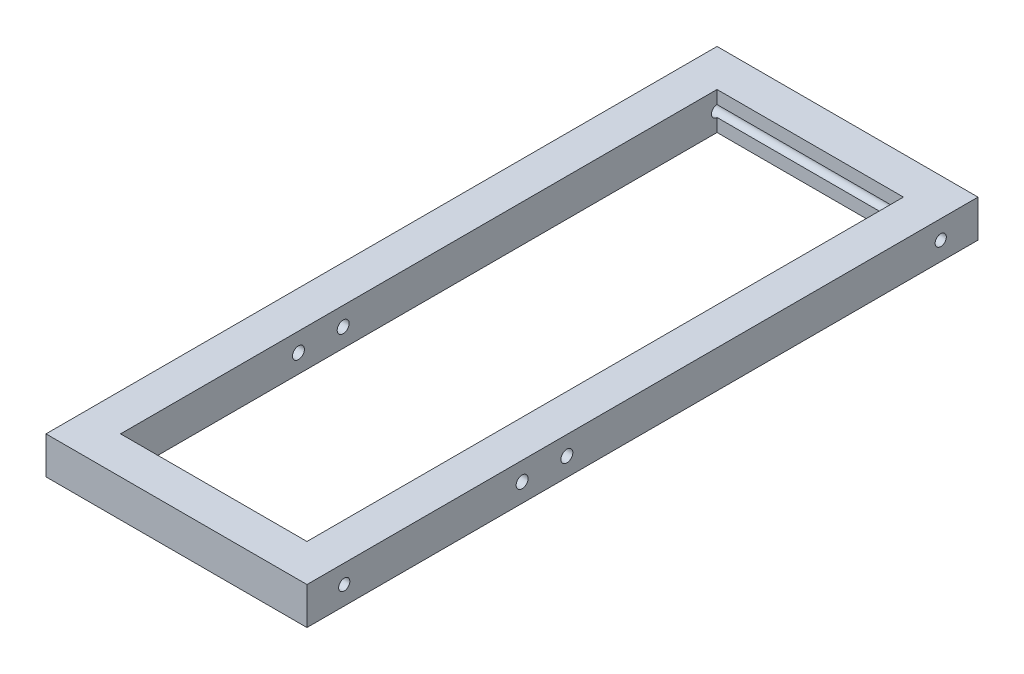
ISO-10303-21;
HEADER;
FILE_DESCRIPTION(('STEP AP214'),'2;1');
FILE_NAME('part.step','',(''),(''),'','','');
FILE_SCHEMA(('AUTOMOTIVE_DESIGN { 1 0 10303 214 1 1 1 1 }'));
ENDSEC;
DATA;
#1=APPLICATION_CONTEXT('core data for automotive mechanical design processes');
#2=APPLICATION_PROTOCOL_DEFINITION('international standard','automotive_design',2000,#1);
#3=PRODUCT_CONTEXT('',#1,'mechanical');
#4=PRODUCT('Part','Part','',(#3));
#5=PRODUCT_RELATED_PRODUCT_CATEGORY('part','',(#4));
#6=PRODUCT_DEFINITION_FORMATION('','',#4);
#7=PRODUCT_DEFINITION_CONTEXT('part definition',#1,'design');
#8=PRODUCT_DEFINITION('design','',#6,#7);
#9=PRODUCT_DEFINITION_SHAPE('','',#8);
#10=(LENGTH_UNIT() NAMED_UNIT(*) SI_UNIT(.MILLI.,.METRE.));
#11=(NAMED_UNIT(*) PLANE_ANGLE_UNIT() SI_UNIT($,.RADIAN.));
#12=(NAMED_UNIT(*) SI_UNIT($,.STERADIAN.) SOLID_ANGLE_UNIT());
#13=UNCERTAINTY_MEASURE_WITH_UNIT(LENGTH_MEASURE(1.E-05),#10,'distance_accuracy_value','');
#14=(GEOMETRIC_REPRESENTATION_CONTEXT(3) GLOBAL_UNCERTAINTY_ASSIGNED_CONTEXT((#13)) GLOBAL_UNIT_ASSIGNED_CONTEXT((#10,
#11,#12)) REPRESENTATION_CONTEXT('',''));
#15=CARTESIAN_POINT('',(0.,0.,0.));
#16=DIRECTION('',(0.,0.,1.));
#17=DIRECTION('',(1.,0.,0.));
#18=AXIS2_PLACEMENT_3D('',#15,#16,#17);
#19=CARTESIAN_POINT('',(-25.,5.,80.));
#20=DIRECTION('',(0.,0.,-1.));
#21=DIRECTION('',(-1.,0.,0.));
#22=AXIS2_PLACEMENT_3D('',#19,#20,#21);
#23=PLANE('',#22);
#24=DIRECTION('',(1.,0.,0.));
#25=VECTOR('',#24,1.);
#26=CARTESIAN_POINT('',(-60.,1.49999999999998,80.));
#27=LINE('',#26,#25);
#28=CARTESIAN_POINT('',(-25.,1.49999999999998,80.));
#29=VERTEX_POINT('',#28);
#30=CARTESIAN_POINT('',(25.,1.49999999999998,80.));
#31=VERTEX_POINT('',#30);
#32=EDGE_CURVE('E248',#29,#31,#27,.T.);
#33=ORIENTED_EDGE('',*,*,#32,.F.);
#34=DIRECTION('',(0.,-1.,0.));
#35=VECTOR('',#34,1.);
#36=CARTESIAN_POINT('',(-25.,5.,80.));
#37=LINE('',#36,#35);
#38=CARTESIAN_POINT('',(-25.,5.,80.));
#39=VERTEX_POINT('',#38);
#40=EDGE_CURVE('E154',#39,#29,#37,.T.);
#41=ORIENTED_EDGE('',*,*,#40,.F.);
#42=DIRECTION('',(1.,0.,0.));
#43=VECTOR('',#42,1.);
#44=CARTESIAN_POINT('',(-25.,5.,80.));
#45=LINE('',#44,#43);
#46=CARTESIAN_POINT('',(25.,5.,80.));
#47=VERTEX_POINT('',#46);
#48=EDGE_CURVE('E263',#39,#47,#45,.T.);
#49=ORIENTED_EDGE('',*,*,#48,.T.);
#50=DIRECTION('',(0.,-1.,0.));
#51=VECTOR('',#50,1.);
#52=CARTESIAN_POINT('',(25.,5.,80.));
#53=LINE('',#52,#51);
#54=EDGE_CURVE('E168',#47,#31,#53,.T.);
#55=ORIENTED_EDGE('',*,*,#54,.T.);
#56=EDGE_LOOP('',(#33,#41,#49,#55));
#57=FACE_BOUND('',#56,.T.);
#58=ADVANCED_FACE('F39',(#57),#23,.T.);
#59=CARTESIAN_POINT('',(-25.,5.,-80.));
#60=DIRECTION('',(0.,0.,1.));
#61=DIRECTION('',(1.,0.,0.));
#62=AXIS2_PLACEMENT_3D('',#59,#60,#61);
#63=PLANE('',#62);
#64=DIRECTION('',(1.,0.,0.));
#65=VECTOR('',#64,1.);
#66=CARTESIAN_POINT('',(-60.,-1.5,-80.));
#67=LINE('',#66,#65);
#68=CARTESIAN_POINT('',(-25.,-1.5,-80.));
#69=VERTEX_POINT('',#68);
#70=CARTESIAN_POINT('',(25.,-1.5,-80.));
#71=VERTEX_POINT('',#70);
#72=EDGE_CURVE('E130',#69,#71,#67,.T.);
#73=ORIENTED_EDGE('',*,*,#72,.F.);
#74=DIRECTION('',(0.,-1.,0.));
#75=VECTOR('',#74,1.);
#76=CARTESIAN_POINT('',(-25.,5.,-80.));
#77=LINE('',#76,#75);
#78=CARTESIAN_POINT('',(-25.,-5.,-80.));
#79=VERTEX_POINT('',#78);
#80=EDGE_CURVE('E142',#69,#79,#77,.T.);
#81=ORIENTED_EDGE('',*,*,#80,.T.);
#82=DIRECTION('',(-1.,0.,0.));
#83=VECTOR('',#82,1.);
#84=CARTESIAN_POINT('',(-25.,-5.,-80.));
#85=LINE('',#84,#83);
#86=CARTESIAN_POINT('',(25.,-5.,-80.));
#87=VERTEX_POINT('',#86);
#88=EDGE_CURVE('E283',#87,#79,#85,.T.);
#89=ORIENTED_EDGE('',*,*,#88,.F.);
#90=DIRECTION('',(0.,-1.,0.));
#91=VECTOR('',#90,1.);
#92=CARTESIAN_POINT('',(25.,5.,-80.));
#93=LINE('',#92,#91);
#94=EDGE_CURVE('E144',#71,#87,#93,.T.);
#95=ORIENTED_EDGE('',*,*,#94,.F.);
#96=EDGE_LOOP('',(#73,#81,#89,#95));
#97=FACE_BOUND('',#96,.T.);
#98=ADVANCED_FACE('F140',(#97),#63,.T.);
#99=CARTESIAN_POINT('',(0.,5.,0.));
#100=DIRECTION('',(0.,-1.,0.));
#101=DIRECTION('',(0.,0.,-1.));
#102=AXIS2_PLACEMENT_3D('',#99,#100,#101);
#103=PLANE('',#102);
#104=DIRECTION('',(0.,0.,-1.));
#105=VECTOR('',#104,1.);
#106=CARTESIAN_POINT('',(35.,5.,90.));
#107=LINE('',#106,#105);
#108=CARTESIAN_POINT('',(35.,5.,90.));
#109=VERTEX_POINT('',#108);
#110=CARTESIAN_POINT('',(35.,5.,-90.));
#111=VERTEX_POINT('',#110);
#112=EDGE_CURVE('E173',#109,#111,#107,.T.);
#113=ORIENTED_EDGE('',*,*,#112,.T.);
#114=DIRECTION('',(-1.,0.,0.));
#115=VECTOR('',#114,1.);
#116=CARTESIAN_POINT('',(-35.,5.,-90.));
#117=LINE('',#116,#115);
#118=CARTESIAN_POINT('',(-35.,5.,-90.));
#119=VERTEX_POINT('',#118);
#120=EDGE_CURVE('E177',#111,#119,#117,.T.);
#121=ORIENTED_EDGE('',*,*,#120,.T.);
#122=DIRECTION('',(0.,0.,1.));
#123=VECTOR('',#122,1.);
#124=CARTESIAN_POINT('',(-35.,5.,90.));
#125=LINE('',#124,#123);
#126=CARTESIAN_POINT('',(-35.,5.,90.));
#127=VERTEX_POINT('',#126);
#128=EDGE_CURVE('E181',#119,#127,#125,.T.);
#129=ORIENTED_EDGE('',*,*,#128,.T.);
#130=DIRECTION('',(1.,0.,0.));
#131=VECTOR('',#130,1.);
#132=CARTESIAN_POINT('',(-35.,5.,90.));
#133=LINE('',#132,#131);
#134=EDGE_CURVE('E184',#127,#109,#133,.T.);
#135=ORIENTED_EDGE('',*,*,#134,.T.);
#136=EDGE_LOOP('',(#113,#121,#129,#135));
#137=FACE_BOUND('',#136,.T.);
#138=ORIENTED_EDGE('',*,*,#48,.F.);
#139=DIRECTION('',(0.,0.,1.));
#140=VECTOR('',#139,1.);
#141=CARTESIAN_POINT('',(-25.,5.,80.));
#142=LINE('',#141,#140);
#143=CARTESIAN_POINT('',(-25.,5.,-80.));
#144=VERTEX_POINT('',#143);
#145=EDGE_CURVE('E273',#144,#39,#142,.T.);
#146=ORIENTED_EDGE('',*,*,#145,.F.);
#147=DIRECTION('',(-1.,0.,0.));
#148=VECTOR('',#147,1.);
#149=CARTESIAN_POINT('',(-25.,5.,-80.));
#150=LINE('',#149,#148);
#151=CARTESIAN_POINT('',(25.,5.,-80.));
#152=VERTEX_POINT('',#151);
#153=EDGE_CURVE('E269',#152,#144,#150,.T.);
#154=ORIENTED_EDGE('',*,*,#153,.F.);
#155=DIRECTION('',(0.,0.,-1.));
#156=VECTOR('',#155,1.);
#157=CARTESIAN_POINT('',(25.,5.,80.));
#158=LINE('',#157,#156);
#159=EDGE_CURVE('E266',#47,#152,#158,.T.);
#160=ORIENTED_EDGE('',*,*,#159,.F.);
#161=EDGE_LOOP('',(#138,#146,#154,#160));
#162=FACE_BOUND('',#161,.T.);
#163=ADVANCED_FACE('F311',(#137,#162),#103,.F.);
#164=CARTESIAN_POINT('',(0.,-5.,0.));
#165=DIRECTION('',(0.,-1.,0.));
#166=DIRECTION('',(0.,0.,-1.));
#167=AXIS2_PLACEMENT_3D('',#164,#165,#166);
#168=PLANE('',#167);
#169=DIRECTION('',(0.,0.,-1.));
#170=VECTOR('',#169,1.);
#171=CARTESIAN_POINT('',(35.,-5.,90.));
#172=LINE('',#171,#170);
#173=CARTESIAN_POINT('',(35.,-5.,90.));
#174=VERTEX_POINT('',#173);
#175=CARTESIAN_POINT('',(35.,-5.,-90.));
#176=VERTEX_POINT('',#175);
#177=EDGE_CURVE('E172',#174,#176,#172,.T.);
#178=ORIENTED_EDGE('',*,*,#177,.F.);
#179=DIRECTION('',(1.,0.,0.));
#180=VECTOR('',#179,1.);
#181=CARTESIAN_POINT('',(-35.,-5.,90.));
#182=LINE('',#181,#180);
#183=CARTESIAN_POINT('',(-35.,-5.,90.));
#184=VERTEX_POINT('',#183);
#185=EDGE_CURVE('E178',#184,#174,#182,.T.);
#186=ORIENTED_EDGE('',*,*,#185,.F.);
#187=DIRECTION('',(0.,0.,1.));
#188=VECTOR('',#187,1.);
#189=CARTESIAN_POINT('',(-35.,-5.,90.));
#190=LINE('',#189,#188);
#191=CARTESIAN_POINT('',(-35.,-5.,-90.));
#192=VERTEX_POINT('',#191);
#193=EDGE_CURVE('E194',#192,#184,#190,.T.);
#194=ORIENTED_EDGE('',*,*,#193,.F.);
#195=DIRECTION('',(-1.,0.,0.));
#196=VECTOR('',#195,1.);
#197=CARTESIAN_POINT('',(-35.,-5.,-90.));
#198=LINE('',#197,#196);
#199=EDGE_CURVE('E191',#176,#192,#198,.T.);
#200=ORIENTED_EDGE('',*,*,#199,.F.);
#201=EDGE_LOOP('',(#178,#186,#194,#200));
#202=FACE_BOUND('',#201,.T.);
#203=DIRECTION('',(0.,0.,1.));
#204=VECTOR('',#203,1.);
#205=CARTESIAN_POINT('',(-25.,-5.,80.));
#206=LINE('',#205,#204);
#207=CARTESIAN_POINT('',(-25.,-5.,80.));
#208=VERTEX_POINT('',#207);
#209=EDGE_CURVE('E150',#79,#208,#206,.T.);
#210=ORIENTED_EDGE('',*,*,#209,.T.);
#211=DIRECTION('',(1.,0.,0.));
#212=VECTOR('',#211,1.);
#213=CARTESIAN_POINT('',(-25.,-5.,80.));
#214=LINE('',#213,#212);
#215=CARTESIAN_POINT('',(25.,-5.,80.));
#216=VERTEX_POINT('',#215);
#217=EDGE_CURVE('E262',#208,#216,#214,.T.);
#218=ORIENTED_EDGE('',*,*,#217,.T.);
#219=DIRECTION('',(0.,0.,-1.));
#220=VECTOR('',#219,1.);
#221=CARTESIAN_POINT('',(25.,-5.,80.));
#222=LINE('',#221,#220);
#223=EDGE_CURVE('E279',#216,#87,#222,.T.);
#224=ORIENTED_EDGE('',*,*,#223,.T.);
#225=ORIENTED_EDGE('',*,*,#88,.T.);
#226=EDGE_LOOP('',(#210,#218,#224,#225));
#227=FACE_BOUND('',#226,.T.);
#228=ADVANCED_FACE('F287',(#202,#227),#168,.T.);
#229=CARTESIAN_POINT('',(35.,5.,90.));
#230=DIRECTION('',(-1.,0.,0.));
#231=DIRECTION('',(0.,0.,1.));
#232=AXIS2_PLACEMENT_3D('',#229,#230,#231);
#233=PLANE('',#232);
#234=CARTESIAN_POINT('',(35.,-0.0109282709262837,32.2875238508389));
#235=DIRECTION('',(-1.,0.,0.));
#236=DIRECTION('',(0.,0.,1.));
#237=AXIS2_PLACEMENT_3D('',#234,#235,#236);
#238=CIRCLE('',#237,1.59999999999999);
#239=CARTESIAN_POINT('',(35.,-0.0109282709262837,33.8875238508389));
#240=VERTEX_POINT('',#239);
#241=EDGE_CURVE('E488',#240,#240,#238,.T.);
#242=ORIENTED_EDGE('',*,*,#241,.T.);
#243=EDGE_LOOP('',(#242));
#244=FACE_BOUND('',#243,.T.);
#245=CARTESIAN_POINT('',(35.,-0.00299899200374121,20.2858146368323));
#246=DIRECTION('',(-1.,0.,0.));
#247=DIRECTION('',(0.,0.,1.));
#248=AXIS2_PLACEMENT_3D('',#245,#246,#247);
#249=CIRCLE('',#248,1.59999999999999);
#250=CARTESIAN_POINT('',(35.,-0.00299899200374121,21.8858146368323));
#251=VERTEX_POINT('',#250);
#252=EDGE_CURVE('E216',#251,#251,#249,.T.);
#253=ORIENTED_EDGE('',*,*,#252,.T.);
#254=EDGE_LOOP('',(#253));
#255=FACE_BOUND('',#254,.T.);
#256=CARTESIAN_POINT('',(35.,0.,80.));
#257=DIRECTION('',(-1.,0.,0.));
#258=DIRECTION('',(0.,0.,1.));
#259=AXIS2_PLACEMENT_3D('',#256,#257,#258);
#260=CIRCLE('',#259,1.5);
#261=CARTESIAN_POINT('',(35.,0.,81.5));
#262=VERTEX_POINT('',#261);
#263=EDGE_CURVE('E258',#262,#262,#260,.T.);
#264=ORIENTED_EDGE('',*,*,#263,.T.);
#265=EDGE_LOOP('',(#264));
#266=FACE_BOUND('',#265,.T.);
#267=CARTESIAN_POINT('',(35.,0.,-80.));
#268=DIRECTION('',(-1.,0.,0.));
#269=DIRECTION('',(0.,0.,1.));
#270=AXIS2_PLACEMENT_3D('',#267,#268,#269);
#271=CIRCLE('',#270,1.5);
#272=CARTESIAN_POINT('',(35.,0.,-78.5));
#273=VERTEX_POINT('',#272);
#274=EDGE_CURVE('E242',#273,#273,#271,.T.);
#275=ORIENTED_EDGE('',*,*,#274,.T.);
#276=EDGE_LOOP('',(#275));
#277=FACE_BOUND('',#276,.T.);
#278=ORIENTED_EDGE('',*,*,#177,.T.);
#279=DIRECTION('',(0.,-1.,0.));
#280=VECTOR('',#279,1.);
#281=CARTESIAN_POINT('',(35.,5.,-90.));
#282=LINE('',#281,#280);
#283=EDGE_CURVE('E136',#111,#176,#282,.T.);
#284=ORIENTED_EDGE('',*,*,#283,.F.);
#285=ORIENTED_EDGE('',*,*,#112,.F.);
#286=DIRECTION('',(0.,-1.,0.));
#287=VECTOR('',#286,1.);
#288=CARTESIAN_POINT('',(35.,5.,90.));
#289=LINE('',#288,#287);
#290=EDGE_CURVE('E187',#109,#174,#289,.T.);
#291=ORIENTED_EDGE('',*,*,#290,.T.);
#292=EDGE_LOOP('',(#278,#284,#285,#291));
#293=FACE_BOUND('',#292,.T.);
#294=ADVANCED_FACE('F41',(#244,#255,#266,#277,#293),#233,.F.);
#295=CARTESIAN_POINT('',(-35.,5.,-90.));
#296=DIRECTION('',(0.,0.,1.));
#297=DIRECTION('',(1.,0.,0.));
#298=AXIS2_PLACEMENT_3D('',#295,#296,#297);
#299=PLANE('',#298);
#300=ORIENTED_EDGE('',*,*,#199,.T.);
#301=DIRECTION('',(0.,-1.,0.));
#302=VECTOR('',#301,1.);
#303=CARTESIAN_POINT('',(-35.,5.,-90.));
#304=LINE('',#303,#302);
#305=EDGE_CURVE('E206',#119,#192,#304,.T.);
#306=ORIENTED_EDGE('',*,*,#305,.F.);
#307=ORIENTED_EDGE('',*,*,#120,.F.);
#308=ORIENTED_EDGE('',*,*,#283,.T.);
#309=EDGE_LOOP('',(#300,#306,#307,#308));
#310=FACE_BOUND('',#309,.T.);
#311=ADVANCED_FACE('F342',(#310),#299,.F.);
#312=CARTESIAN_POINT('',(-35.,5.,90.));
#313=DIRECTION('',(1.,0.,0.));
#314=DIRECTION('',(0.,0.,-1.));
#315=AXIS2_PLACEMENT_3D('',#312,#313,#314);
#316=PLANE('',#315);
#317=CARTESIAN_POINT('',(-35.,-0.0109282709262837,32.2875238508389));
#318=DIRECTION('',(-1.,0.,0.));
#319=DIRECTION('',(0.,0.,1.));
#320=AXIS2_PLACEMENT_3D('',#317,#318,#319);
#321=CIRCLE('',#320,1.6);
#322=CARTESIAN_POINT('',(-35.,-0.0109282709262837,33.8875238508389));
#323=VERTEX_POINT('',#322);
#324=EDGE_CURVE('E490',#323,#323,#321,.T.);
#325=ORIENTED_EDGE('',*,*,#324,.F.);
#326=EDGE_LOOP('',(#325));
#327=FACE_BOUND('',#326,.T.);
#328=CARTESIAN_POINT('',(-35.,-0.00299899200374121,20.2858146368323));
#329=DIRECTION('',(-1.,0.,0.));
#330=DIRECTION('',(0.,0.,1.));
#331=AXIS2_PLACEMENT_3D('',#328,#329,#330);
#332=CIRCLE('',#331,1.6);
#333=CARTESIAN_POINT('',(-35.,-0.00299899200374121,21.8858146368323));
#334=VERTEX_POINT('',#333);
#335=EDGE_CURVE('E224',#334,#334,#332,.T.);
#336=ORIENTED_EDGE('',*,*,#335,.F.);
#337=EDGE_LOOP('',(#336));
#338=FACE_BOUND('',#337,.T.);
#339=CARTESIAN_POINT('',(-35.,0.,80.));
#340=DIRECTION('',(1.,0.,0.));
#341=DIRECTION('',(0.,0.,-1.));
#342=AXIS2_PLACEMENT_3D('',#339,#340,#341);
#343=CIRCLE('',#342,1.5);
#344=CARTESIAN_POINT('',(-35.,0.,78.5));
#345=VERTEX_POINT('',#344);
#346=EDGE_CURVE('E254',#345,#345,#343,.T.);
#347=ORIENTED_EDGE('',*,*,#346,.T.);
#348=EDGE_LOOP('',(#347));
#349=FACE_BOUND('',#348,.T.);
#350=CARTESIAN_POINT('',(-35.,0.,-80.));
#351=DIRECTION('',(1.,0.,0.));
#352=DIRECTION('',(0.,0.,-1.));
#353=AXIS2_PLACEMENT_3D('',#350,#351,#352);
#354=CIRCLE('',#353,1.5);
#355=CARTESIAN_POINT('',(-35.,0.,-81.5));
#356=VERTEX_POINT('',#355);
#357=EDGE_CURVE('E238',#356,#356,#354,.T.);
#358=ORIENTED_EDGE('',*,*,#357,.T.);
#359=EDGE_LOOP('',(#358));
#360=FACE_BOUND('',#359,.T.);
#361=ORIENTED_EDGE('',*,*,#193,.T.);
#362=DIRECTION('',(0.,-1.,0.));
#363=VECTOR('',#362,1.);
#364=CARTESIAN_POINT('',(-35.,5.,90.));
#365=LINE('',#364,#363);
#366=EDGE_CURVE('E202',#127,#184,#365,.T.);
#367=ORIENTED_EDGE('',*,*,#366,.F.);
#368=ORIENTED_EDGE('',*,*,#128,.F.);
#369=ORIENTED_EDGE('',*,*,#305,.T.);
#370=EDGE_LOOP('',(#361,#367,#368,#369));
#371=FACE_BOUND('',#370,.T.);
#372=ADVANCED_FACE('F336',(#327,#338,#349,#360,#371),#316,.F.);
#373=CARTESIAN_POINT('',(-35.,5.,90.));
#374=DIRECTION('',(0.,0.,-1.));
#375=DIRECTION('',(-1.,0.,0.));
#376=AXIS2_PLACEMENT_3D('',#373,#374,#375);
#377=PLANE('',#376);
#378=ORIENTED_EDGE('',*,*,#185,.T.);
#379=ORIENTED_EDGE('',*,*,#290,.F.);
#380=ORIENTED_EDGE('',*,*,#134,.F.);
#381=ORIENTED_EDGE('',*,*,#366,.T.);
#382=EDGE_LOOP('',(#378,#379,#380,#381));
#383=FACE_BOUND('',#382,.T.);
#384=ADVANCED_FACE('F332',(#383),#377,.F.);
#385=DIRECTION('',(1.,0.,0.));
#386=VECTOR('',#385,1.);
#387=CARTESIAN_POINT('',(-60.,-1.50000000000002,80.));
#388=LINE('',#387,#386);
#389=CARTESIAN_POINT('',(25.,-1.50000000000002,80.));
#390=VERTEX_POINT('',#389);
#391=CARTESIAN_POINT('',(-25.,-1.50000000000002,80.));
#392=VERTEX_POINT('',#391);
#393=EDGE_CURVE('E56',#390,#392,#388,.F.);
#394=ORIENTED_EDGE('',*,*,#393,.F.);
#395=EDGE_CURVE('E167',#390,#216,#53,.T.);
#396=ORIENTED_EDGE('',*,*,#395,.T.);
#397=ORIENTED_EDGE('',*,*,#217,.F.);
#398=EDGE_CURVE('E159',#392,#208,#37,.T.);
#399=ORIENTED_EDGE('',*,*,#398,.F.);
#400=EDGE_LOOP('',(#394,#396,#397,#399));
#401=FACE_BOUND('',#400,.T.);
#402=ADVANCED_FACE('F297',(#401),#23,.T.);
#403=CARTESIAN_POINT('',(25.,5.,80.));
#404=DIRECTION('',(-1.,0.,0.));
#405=DIRECTION('',(0.,0.,1.));
#406=AXIS2_PLACEMENT_3D('',#403,#404,#405);
#407=PLANE('',#406);
#408=CARTESIAN_POINT('',(25.,-0.0109282709262837,32.2875238508389));
#409=DIRECTION('',(-1.,0.,0.));
#410=DIRECTION('',(0.,0.,1.));
#411=AXIS2_PLACEMENT_3D('',#408,#409,#410);
#412=CIRCLE('',#411,1.6);
#413=CARTESIAN_POINT('',(25.,-0.0109282709262837,33.8875238508389));
#414=VERTEX_POINT('',#413);
#415=EDGE_CURVE('E230',#414,#414,#412,.T.);
#416=ORIENTED_EDGE('',*,*,#415,.F.);
#417=EDGE_LOOP('',(#416));
#418=FACE_BOUND('',#417,.T.);
#419=CARTESIAN_POINT('',(25.,-0.00299899200374121,20.2858146368323));
#420=DIRECTION('',(-1.,0.,0.));
#421=DIRECTION('',(0.,0.,1.));
#422=AXIS2_PLACEMENT_3D('',#419,#420,#421);
#423=CIRCLE('',#422,1.6);
#424=CARTESIAN_POINT('',(25.,-0.00299899200374121,21.8858146368323));
#425=VERTEX_POINT('',#424);
#426=EDGE_CURVE('E215',#425,#425,#423,.T.);
#427=ORIENTED_EDGE('',*,*,#426,.F.);
#428=EDGE_LOOP('',(#427));
#429=FACE_BOUND('',#428,.T.);
#430=CARTESIAN_POINT('',(25.,0.,80.));
#431=DIRECTION('',(-1.,0.,0.));
#432=DIRECTION('',(0.,0.,1.));
#433=AXIS2_PLACEMENT_3D('',#430,#431,#432);
#434=CIRCLE('',#433,1.5);
#435=EDGE_CURVE('E251',#31,#390,#434,.T.);
#436=ORIENTED_EDGE('',*,*,#435,.F.);
#437=ORIENTED_EDGE('',*,*,#54,.F.);
#438=ORIENTED_EDGE('',*,*,#159,.T.);
#439=CARTESIAN_POINT('',(25.,1.5,-80.));
#440=VERTEX_POINT('',#439);
#441=EDGE_CURVE('E163',#152,#440,#93,.T.);
#442=ORIENTED_EDGE('',*,*,#441,.T.);
#443=CARTESIAN_POINT('',(25.,0.,-80.));
#444=DIRECTION('',(-1.,0.,0.));
#445=DIRECTION('',(0.,0.,1.));
#446=AXIS2_PLACEMENT_3D('',#443,#444,#445);
#447=CIRCLE('',#446,1.5);
#448=EDGE_CURVE('E146',#71,#440,#447,.T.);
#449=ORIENTED_EDGE('',*,*,#448,.F.);
#450=ORIENTED_EDGE('',*,*,#94,.T.);
#451=ORIENTED_EDGE('',*,*,#223,.F.);
#452=ORIENTED_EDGE('',*,*,#395,.F.);
#453=EDGE_LOOP('',(#436,#437,#438,#442,#449,#450,#451,#452));
#454=FACE_BOUND('',#453,.T.);
#455=ADVANCED_FACE('F293',(#418,#429,#454),#407,.T.);
#456=DIRECTION('',(1.,0.,0.));
#457=VECTOR('',#456,1.);
#458=CARTESIAN_POINT('',(-60.,1.5,-80.));
#459=LINE('',#458,#457);
#460=CARTESIAN_POINT('',(-25.,1.5,-80.));
#461=VERTEX_POINT('',#460);
#462=EDGE_CURVE('E64',#440,#461,#459,.F.);
#463=ORIENTED_EDGE('',*,*,#462,.F.);
#464=ORIENTED_EDGE('',*,*,#441,.F.);
#465=ORIENTED_EDGE('',*,*,#153,.T.);
#466=EDGE_CURVE('E153',#144,#461,#77,.T.);
#467=ORIENTED_EDGE('',*,*,#466,.T.);
#468=EDGE_LOOP('',(#463,#464,#465,#467));
#469=FACE_BOUND('',#468,.T.);
#470=ADVANCED_FACE('F314',(#469),#63,.T.);
#471=CARTESIAN_POINT('',(-25.,5.,80.));
#472=DIRECTION('',(1.,0.,0.));
#473=DIRECTION('',(0.,0.,-1.));
#474=AXIS2_PLACEMENT_3D('',#471,#472,#473);
#475=PLANE('',#474);
#476=CARTESIAN_POINT('',(-25.,-0.0109282709262837,32.2875238508389));
#477=DIRECTION('',(1.,0.,0.));
#478=DIRECTION('',(0.,0.,-1.));
#479=AXIS2_PLACEMENT_3D('',#476,#477,#478);
#480=CIRCLE('',#479,1.6);
#481=CARTESIAN_POINT('',(-25.,-0.0109282709262837,30.6875238508389));
#482=VERTEX_POINT('',#481);
#483=EDGE_CURVE('E43',#482,#482,#480,.T.);
#484=ORIENTED_EDGE('',*,*,#483,.F.);
#485=EDGE_LOOP('',(#484));
#486=FACE_BOUND('',#485,.T.);
#487=CARTESIAN_POINT('',(-25.,-0.00299899200374121,20.2858146368323));
#488=DIRECTION('',(1.,0.,0.));
#489=DIRECTION('',(0.,0.,-1.));
#490=AXIS2_PLACEMENT_3D('',#487,#488,#489);
#491=CIRCLE('',#490,1.6);
#492=CARTESIAN_POINT('',(-25.,-0.00299899200374121,18.6858146368323));
#493=VERTEX_POINT('',#492);
#494=EDGE_CURVE('E212',#493,#493,#491,.T.);
#495=ORIENTED_EDGE('',*,*,#494,.F.);
#496=EDGE_LOOP('',(#495));
#497=FACE_BOUND('',#496,.T.);
#498=CARTESIAN_POINT('',(-25.,0.,80.));
#499=DIRECTION('',(1.,0.,0.));
#500=DIRECTION('',(0.,0.,-1.));
#501=AXIS2_PLACEMENT_3D('',#498,#499,#500);
#502=CIRCLE('',#501,1.5);
#503=EDGE_CURVE('E11',#392,#29,#502,.T.);
#504=ORIENTED_EDGE('',*,*,#503,.F.);
#505=ORIENTED_EDGE('',*,*,#398,.T.);
#506=ORIENTED_EDGE('',*,*,#209,.F.);
#507=ORIENTED_EDGE('',*,*,#80,.F.);
#508=CARTESIAN_POINT('',(-25.,0.,-80.));
#509=DIRECTION('',(1.,0.,0.));
#510=DIRECTION('',(0.,0.,-1.));
#511=AXIS2_PLACEMENT_3D('',#508,#509,#510);
#512=CIRCLE('',#511,1.5);
#513=EDGE_CURVE('E49',#461,#69,#512,.T.);
#514=ORIENTED_EDGE('',*,*,#513,.F.);
#515=ORIENTED_EDGE('',*,*,#466,.F.);
#516=ORIENTED_EDGE('',*,*,#145,.T.);
#517=ORIENTED_EDGE('',*,*,#40,.T.);
#518=EDGE_LOOP('',(#504,#505,#506,#507,#514,#515,#516,#517));
#519=FACE_BOUND('',#518,.T.);
#520=ADVANCED_FACE('F148',(#486,#497,#519),#475,.T.);
#521=CARTESIAN_POINT('',(-60.,0.,-80.));
#522=DIRECTION('',(1.,0.,0.));
#523=DIRECTION('',(0.,0.,-1.));
#524=AXIS2_PLACEMENT_3D('',#521,#522,#523);
#525=CYLINDRICAL_SURFACE('',#524,1.5);
#526=ORIENTED_EDGE('',*,*,#357,.F.);
#527=EDGE_LOOP('',(#526));
#528=FACE_BOUND('',#527,.T.);
#529=ORIENTED_EDGE('',*,*,#448,.T.);
#530=ORIENTED_EDGE('',*,*,#462,.T.);
#531=ORIENTED_EDGE('',*,*,#513,.T.);
#532=ORIENTED_EDGE('',*,*,#72,.T.);
#533=EDGE_LOOP('',(#529,#530,#531,#532));
#534=FACE_BOUND('',#533,.T.);
#535=ORIENTED_EDGE('',*,*,#274,.F.);
#536=EDGE_LOOP('',(#535));
#537=FACE_BOUND('',#536,.T.);
#538=ADVANCED_FACE('F128',(#528,#534,#537),#525,.F.);
#539=CARTESIAN_POINT('',(-60.,0.,80.));
#540=DIRECTION('',(1.,0.,0.));
#541=DIRECTION('',(0.,0.,-1.));
#542=AXIS2_PLACEMENT_3D('',#539,#540,#541);
#543=CYLINDRICAL_SURFACE('',#542,1.5);
#544=ORIENTED_EDGE('',*,*,#346,.F.);
#545=EDGE_LOOP('',(#544));
#546=FACE_BOUND('',#545,.T.);
#547=ORIENTED_EDGE('',*,*,#435,.T.);
#548=ORIENTED_EDGE('',*,*,#393,.T.);
#549=ORIENTED_EDGE('',*,*,#503,.T.);
#550=ORIENTED_EDGE('',*,*,#32,.T.);
#551=EDGE_LOOP('',(#547,#548,#549,#550));
#552=FACE_BOUND('',#551,.T.);
#553=ORIENTED_EDGE('',*,*,#263,.F.);
#554=EDGE_LOOP('',(#553));
#555=FACE_BOUND('',#554,.T.);
#556=ADVANCED_FACE('F302',(#546,#552,#555),#543,.F.);
#557=CARTESIAN_POINT('',(-35.,-0.00299899200374121,20.2858146368323));
#558=DIRECTION('',(-1.,0.,0.));
#559=DIRECTION('',(0.,0.,1.));
#560=AXIS2_PLACEMENT_3D('',#557,#558,#559);
#561=CYLINDRICAL_SURFACE('',#560,1.6);
#562=ORIENTED_EDGE('',*,*,#494,.T.);
#563=EDGE_LOOP('',(#562));
#564=FACE_BOUND('',#563,.T.);
#565=ORIENTED_EDGE('',*,*,#335,.T.);
#566=EDGE_LOOP('',(#565));
#567=FACE_BOUND('',#566,.T.);
#568=ADVANCED_FACE('F410',(#564,#567),#561,.F.);
#569=ORIENTED_EDGE('',*,*,#426,.T.);
#570=EDGE_LOOP('',(#569));
#571=FACE_BOUND('',#570,.T.);
#572=ORIENTED_EDGE('',*,*,#252,.F.);
#573=EDGE_LOOP('',(#572));
#574=FACE_BOUND('',#573,.T.);
#575=ADVANCED_FACE('F415',(#571,#574),#561,.F.);
#576=CARTESIAN_POINT('',(-35.,-0.0109282709262837,32.2875238508389));
#577=DIRECTION('',(-1.,0.,0.));
#578=DIRECTION('',(0.,0.,1.));
#579=AXIS2_PLACEMENT_3D('',#576,#577,#578);
#580=CYLINDRICAL_SURFACE('',#579,1.6);
#581=ORIENTED_EDGE('',*,*,#483,.T.);
#582=EDGE_LOOP('',(#581));
#583=FACE_BOUND('',#582,.T.);
#584=ORIENTED_EDGE('',*,*,#324,.T.);
#585=EDGE_LOOP('',(#584));
#586=FACE_BOUND('',#585,.T.);
#587=ADVANCED_FACE('F424',(#583,#586),#580,.F.);
#588=ORIENTED_EDGE('',*,*,#415,.T.);
#589=EDGE_LOOP('',(#588));
#590=FACE_BOUND('',#589,.T.);
#591=ORIENTED_EDGE('',*,*,#241,.F.);
#592=EDGE_LOOP('',(#591));
#593=FACE_BOUND('',#592,.T.);
#594=ADVANCED_FACE('F433',(#590,#593),#580,.F.);
#595=CLOSED_SHELL('',(#58,#98,#163,#228,#294,#311,#372,#384,#402,#455,#470,#520,#538,#556,#568,
#575,#587,#594));
#596=MANIFOLD_SOLID_BREP('B2',#595);
#597=ADVANCED_BREP_SHAPE_REPRESENTATION('',(#18,#596),#14);
#598=SHAPE_DEFINITION_REPRESENTATION(#9,#597);
ENDSEC;
END-ISO-10303-21;
